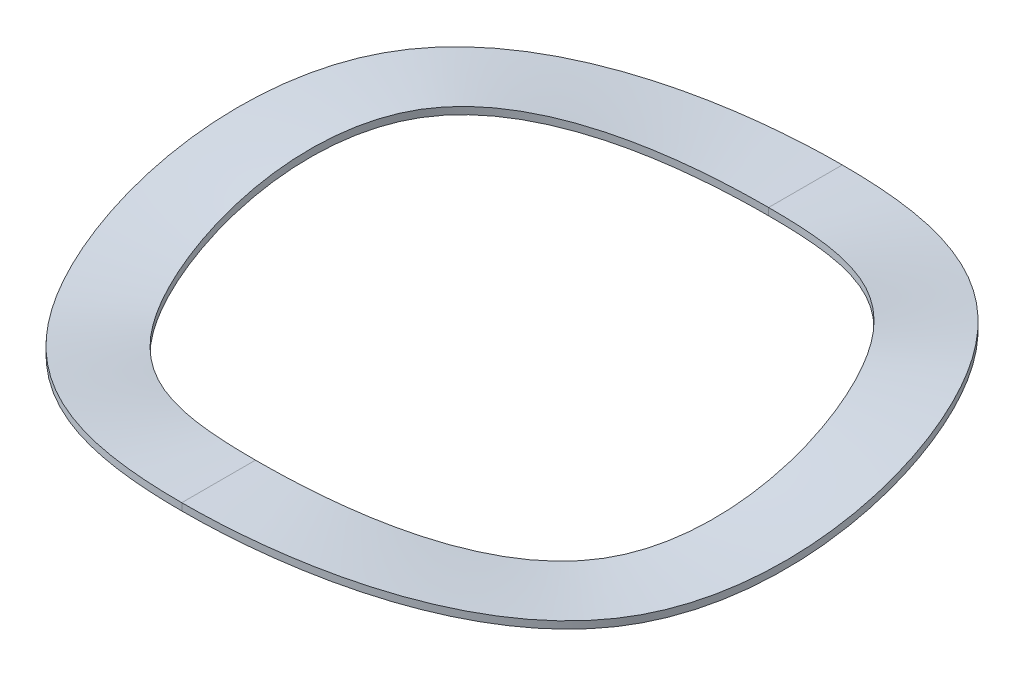
ISO-10303-21;
HEADER;
FILE_DESCRIPTION(('STEP AP214'),'2;1');
FILE_NAME('part.step','',(''),(''),'','','');
FILE_SCHEMA(('AUTOMOTIVE_DESIGN { 1 0 10303 214 1 1 1 1 }'));
ENDSEC;
DATA;
#1=APPLICATION_CONTEXT('core data for automotive mechanical design processes');
#2=APPLICATION_PROTOCOL_DEFINITION('international standard','automotive_design',2000,#1);
#3=PRODUCT_CONTEXT('',#1,'mechanical');
#4=PRODUCT('Part','Part','',(#3));
#5=PRODUCT_RELATED_PRODUCT_CATEGORY('part','',(#4));
#6=PRODUCT_DEFINITION_FORMATION('','',#4);
#7=PRODUCT_DEFINITION_CONTEXT('part definition',#1,'design');
#8=PRODUCT_DEFINITION('design','',#6,#7);
#9=PRODUCT_DEFINITION_SHAPE('','',#8);
#10=(LENGTH_UNIT() NAMED_UNIT(*) SI_UNIT(.MILLI.,.METRE.));
#11=(NAMED_UNIT(*) PLANE_ANGLE_UNIT() SI_UNIT($,.RADIAN.));
#12=(NAMED_UNIT(*) SI_UNIT($,.STERADIAN.) SOLID_ANGLE_UNIT());
#13=UNCERTAINTY_MEASURE_WITH_UNIT(LENGTH_MEASURE(1.E-05),#10,'distance_accuracy_value','');
#14=(GEOMETRIC_REPRESENTATION_CONTEXT(3) GLOBAL_UNCERTAINTY_ASSIGNED_CONTEXT((#13)) GLOBAL_UNIT_ASSIGNED_CONTEXT((#10,
#11,#12)) REPRESENTATION_CONTEXT('',''));
#15=CARTESIAN_POINT('',(0.,0.,0.));
#16=DIRECTION('',(0.,0.,1.));
#17=DIRECTION('',(1.,0.,0.));
#18=AXIS2_PLACEMENT_3D('',#15,#16,#17);
#19=CARTESIAN_POINT('',(0.,0.3048,-10.8712));
#20=CARTESIAN_POINT('',(3.76589414784855,0.3048,-10.8712));
#21=CARTESIAN_POINT('',(11.2976824435457,3.5052,-6.52272));
#22=CARTESIAN_POINT('',(11.2976824435456,-1.2954,6.52272));
#23=CARTESIAN_POINT('',(3.76589414784856,1.905,10.8712));
#24=CARTESIAN_POINT('',(0.,1.905,10.8712));
#25=CARTESIAN_POINT('',(0.,0.2032,-10.8712));
#26=CARTESIAN_POINT('',(3.76589414784855,0.2032,-10.8712));
#27=CARTESIAN_POINT('',(11.2976824435457,3.4036,-6.52272));
#28=CARTESIAN_POINT('',(11.2976824435456,-1.397,6.52272));
#29=CARTESIAN_POINT('',(3.76589414784856,1.8034,10.8712));
#30=CARTESIAN_POINT('',(0.,1.8034,10.8712));
#31=CARTESIAN_POINT('',(0.,0.1016,-10.8712));
#32=CARTESIAN_POINT('',(3.76589414784855,0.101599999999999,-10.8712));
#33=CARTESIAN_POINT('',(11.2976824435457,3.302,-6.52272));
#34=CARTESIAN_POINT('',(11.2976824435456,-1.4986,6.52272));
#35=CARTESIAN_POINT('',(3.76589414784856,1.7018,10.8712));
#36=CARTESIAN_POINT('',(0.,1.7018,10.8712));
#37=CARTESIAN_POINT('',(0.,0.,-10.8712));
#38=CARTESIAN_POINT('',(3.76589414784855,0.,-10.8712));
#39=CARTESIAN_POINT('',(11.2976824435457,3.2004,-6.52272));
#40=CARTESIAN_POINT('',(11.2976824435456,-1.6002,6.52272));
#41=CARTESIAN_POINT('',(3.76589414784856,1.6002,10.8712));
#42=CARTESIAN_POINT('',(0.,1.6002,10.8712));
#43=(BOUNDED_SURFACE() B_SPLINE_SURFACE(3,3,((#19,#20,#21,#22,#23,#24),(#25,#26,#27,#28,#29,
#30),(#31,#32,#33,#34,#35,#36),(#37,#38,#39,#40,#41,#42)),.UNSPECIFIED.,.F.,.F.,
.F.) B_SPLINE_SURFACE_WITH_KNOTS((4,4),(4,1,1,4),(0.,1.),(0.,0.166666666666667,
0.333333333333334,0.5),
.UNSPECIFIED.) GEOMETRIC_REPRESENTATION_ITEM() RATIONAL_B_SPLINE_SURFACE(((1.,1.,1.,1.,1.,1.),
(1.,1.,1.,1.,1.,1.),(1.,1.,1.,1.,1.,1.),(1.,1.,1.,1.,1.,1.))) REPRESENTATION_ITEM('') SURFACE());
#44=CARTESIAN_POINT('',(0.,1.905,10.8712));
#45=CARTESIAN_POINT('',(0.,1.8034,10.8712));
#46=CARTESIAN_POINT('',(0.,1.7018,10.8712));
#47=CARTESIAN_POINT('',(0.,1.6002,10.8712));
#48=(BOUNDED_CURVE() B_SPLINE_CURVE(3,(#44,#45,#46,#47),.UNSPECIFIED.,.F.,
.F.) B_SPLINE_CURVE_WITH_KNOTS((4,4),(0.,1.),
.UNSPECIFIED.) CURVE() GEOMETRIC_REPRESENTATION_ITEM() RATIONAL_B_SPLINE_CURVE((1.,1.,1.,1.)) REPRESENTATION_ITEM(''));
#49=CARTESIAN_POINT('',(0.,1.905,10.8712));
#50=VERTEX_POINT('',#49);
#51=CARTESIAN_POINT('',(0.,1.6002,10.8712));
#52=VERTEX_POINT('',#51);
#53=EDGE_CURVE('E81',#50,#52,#48,.T.);
#54=CARTESIAN_POINT('',(0.,0.3048,-10.8712));
#55=CARTESIAN_POINT('',(3.76589414784855,0.3048,-10.8712));
#56=CARTESIAN_POINT('',(11.2976824435457,3.5052,-6.52272));
#57=CARTESIAN_POINT('',(11.2976824435456,-1.2954,6.52272));
#58=CARTESIAN_POINT('',(3.76589414784856,1.905,10.8712));
#59=CARTESIAN_POINT('',(0.,1.905,10.8712));
#60=(BOUNDED_CURVE() B_SPLINE_CURVE(3,(#54,#55,#56,#57,#58,#59),.UNSPECIFIED.,.F.,
.F.) B_SPLINE_CURVE_WITH_KNOTS((4,1,1,4),(0.,0.166666666666667,0.333333333333334,0.5),
.UNSPECIFIED.) CURVE() GEOMETRIC_REPRESENTATION_ITEM() RATIONAL_B_SPLINE_CURVE((1.,1.,1.,1.,1.,1.)) REPRESENTATION_ITEM(''));
#61=CARTESIAN_POINT('',(0.,0.3048,-10.8712));
#62=VERTEX_POINT('',#61);
#63=EDGE_CURVE('E11',#62,#50,#60,.T.);
#64=CARTESIAN_POINT('',(0.,0.3048,-10.8712));
#65=CARTESIAN_POINT('',(0.,0.2032,-10.8712));
#66=CARTESIAN_POINT('',(0.,0.1016,-10.8712));
#67=CARTESIAN_POINT('',(0.,0.,-10.8712));
#68=(BOUNDED_CURVE() B_SPLINE_CURVE(3,(#64,#65,#66,#67),.UNSPECIFIED.,.F.,
.F.) B_SPLINE_CURVE_WITH_KNOTS((4,4),(0.,1.),
.UNSPECIFIED.) CURVE() GEOMETRIC_REPRESENTATION_ITEM() RATIONAL_B_SPLINE_CURVE((1.,1.,1.,1.)) REPRESENTATION_ITEM(''));
#69=CARTESIAN_POINT('',(0.,0.,-10.8712));
#70=VERTEX_POINT('',#69);
#71=EDGE_CURVE('E84',#62,#70,#68,.T.);
#72=CARTESIAN_POINT('',(0.,0.,-10.8712));
#73=CARTESIAN_POINT('',(3.76589414784855,0.,-10.8712));
#74=CARTESIAN_POINT('',(11.2976824435457,3.2004,-6.52272));
#75=CARTESIAN_POINT('',(11.2976824435456,-1.6002,6.52272));
#76=CARTESIAN_POINT('',(3.76589414784856,1.6002,10.8712));
#77=CARTESIAN_POINT('',(0.,1.6002,10.8712));
#78=(BOUNDED_CURVE() B_SPLINE_CURVE(3,(#72,#73,#74,#75,#76,#77),.UNSPECIFIED.,.F.,
.F.) B_SPLINE_CURVE_WITH_KNOTS((4,1,1,4),(0.,0.166666666666667,0.333333333333334,0.5),
.UNSPECIFIED.) CURVE() GEOMETRIC_REPRESENTATION_ITEM() RATIONAL_B_SPLINE_CURVE((1.,1.,1.,1.,1.,1.)) REPRESENTATION_ITEM(''));
#79=EDGE_CURVE('E31',#70,#52,#78,.T.);
#80=ORIENTED_EDGE('',*,*,#53,.F.);
#81=ORIENTED_EDGE('',*,*,#63,.F.);
#82=ORIENTED_EDGE('',*,*,#71,.T.);
#83=ORIENTED_EDGE('',*,*,#79,.T.);
#84=EDGE_LOOP('',(#80,#81,#82,#83));
#85=FACE_BOUND('',#84,.T.);
#86=ADVANCED_FACE('F16',(#85),#43,.T.);
#87=CARTESIAN_POINT('',(0.,0.3048,-13.9954));
#88=CARTESIAN_POINT('',(4.84814877444989,0.3048,-13.9954));
#89=CARTESIAN_POINT('',(14.5444463233497,3.5052,-8.39724));
#90=CARTESIAN_POINT('',(14.5444463233496,-1.2954,8.39724));
#91=CARTESIAN_POINT('',(4.84814877444989,1.905,13.9954));
#92=CARTESIAN_POINT('',(0.,1.905,13.9954));
#93=CARTESIAN_POINT('',(0.,0.3048,-12.954));
#94=CARTESIAN_POINT('',(4.48739723224945,0.3048,-12.954));
#95=CARTESIAN_POINT('',(13.4621916967484,3.5052,-7.7724));
#96=CARTESIAN_POINT('',(13.4621916967483,-1.2954,7.7724));
#97=CARTESIAN_POINT('',(4.48739723224945,1.905,12.954));
#98=CARTESIAN_POINT('',(0.,1.905,12.954));
#99=CARTESIAN_POINT('',(0.,0.3048,-11.9126));
#100=CARTESIAN_POINT('',(4.126645690049,0.3048,-11.9126));
#101=CARTESIAN_POINT('',(12.379937070147,3.5052,-7.14756));
#102=CARTESIAN_POINT('',(12.379937070147,-1.2954,7.14756));
#103=CARTESIAN_POINT('',(4.126645690049,1.905,11.9126));
#104=CARTESIAN_POINT('',(0.,1.905,11.9126));
#105=CARTESIAN_POINT('',(0.,0.3048,-10.8712));
#106=CARTESIAN_POINT('',(3.76589414784855,0.3048,-10.8712));
#107=CARTESIAN_POINT('',(11.2976824435457,3.5052,-6.52272));
#108=CARTESIAN_POINT('',(11.2976824435456,-1.2954,6.52272));
#109=CARTESIAN_POINT('',(3.76589414784856,1.905,10.8712));
#110=CARTESIAN_POINT('',(0.,1.905,10.8712));
#111=(BOUNDED_SURFACE() B_SPLINE_SURFACE(3,3,((#87,#88,#89,#90,#91,#92),(#93,#94,#95,#96,#97,
#98),(#99,#100,#101,#102,#103,#104),(#105,#106,#107,#108,#109,#110)),.UNSPECIFIED.,.F.,.F.,
.F.) B_SPLINE_SURFACE_WITH_KNOTS((4,4),(4,1,1,4),(0.,1.),(0.,0.166666666666667,
0.333333333333334,0.5),
.UNSPECIFIED.) GEOMETRIC_REPRESENTATION_ITEM() RATIONAL_B_SPLINE_SURFACE(((1.,1.,1.,1.,1.,1.),
(1.,1.,1.,1.,1.,1.),(1.,1.,1.,1.,1.,1.),(1.,1.,1.,1.,1.,1.))) REPRESENTATION_ITEM('') SURFACE());
#112=CARTESIAN_POINT('',(0.,1.905,13.9954));
#113=CARTESIAN_POINT('',(0.,1.905,12.954));
#114=CARTESIAN_POINT('',(0.,1.905,11.9126));
#115=CARTESIAN_POINT('',(0.,1.905,10.8712));
#116=(BOUNDED_CURVE() B_SPLINE_CURVE(3,(#112,#113,#114,#115),.UNSPECIFIED.,.F.,
.F.) B_SPLINE_CURVE_WITH_KNOTS((4,4),(0.,1.),
.UNSPECIFIED.) CURVE() GEOMETRIC_REPRESENTATION_ITEM() RATIONAL_B_SPLINE_CURVE((1.,1.,1.,1.)) REPRESENTATION_ITEM(''));
#117=CARTESIAN_POINT('',(0.,1.905,13.9954));
#118=VERTEX_POINT('',#117);
#119=EDGE_CURVE('E193',#118,#50,#116,.T.);
#120=CARTESIAN_POINT('',(0.,0.3048,-13.9954));
#121=CARTESIAN_POINT('',(4.84814877444989,0.3048,-13.9954));
#122=CARTESIAN_POINT('',(14.5444463233497,3.5052,-8.39724));
#123=CARTESIAN_POINT('',(14.5444463233496,-1.2954,8.39724));
#124=CARTESIAN_POINT('',(4.84814877444989,1.905,13.9954));
#125=CARTESIAN_POINT('',(0.,1.905,13.9954));
#126=(BOUNDED_CURVE() B_SPLINE_CURVE(3,(#120,#121,#122,#123,#124,#125),.UNSPECIFIED.,.F.,
.F.) B_SPLINE_CURVE_WITH_KNOTS((4,1,1,4),(0.,0.166666666666667,0.333333333333334,0.5),
.UNSPECIFIED.) CURVE() GEOMETRIC_REPRESENTATION_ITEM() RATIONAL_B_SPLINE_CURVE((1.,1.,1.,1.,1.,1.)) REPRESENTATION_ITEM(''));
#127=CARTESIAN_POINT('',(0.,0.3048,-13.9954));
#128=VERTEX_POINT('',#127);
#129=EDGE_CURVE('E87',#128,#118,#126,.T.);
#130=CARTESIAN_POINT('',(0.,0.3048,-13.9954));
#131=CARTESIAN_POINT('',(0.,0.3048,-12.954));
#132=CARTESIAN_POINT('',(0.,0.3048,-11.9126));
#133=CARTESIAN_POINT('',(0.,0.3048,-10.8712));
#134=(BOUNDED_CURVE() B_SPLINE_CURVE(3,(#130,#131,#132,#133),.UNSPECIFIED.,.F.,
.F.) B_SPLINE_CURVE_WITH_KNOTS((4,4),(0.,1.),
.UNSPECIFIED.) CURVE() GEOMETRIC_REPRESENTATION_ITEM() RATIONAL_B_SPLINE_CURVE((1.,1.,1.,1.)) REPRESENTATION_ITEM(''));
#135=EDGE_CURVE('E22',#128,#62,#134,.T.);
#136=ORIENTED_EDGE('',*,*,#119,.F.);
#137=ORIENTED_EDGE('',*,*,#129,.F.);
#138=ORIENTED_EDGE('',*,*,#135,.T.);
#139=ORIENTED_EDGE('',*,*,#63,.T.);
#140=EDGE_LOOP('',(#136,#137,#138,#139));
#141=FACE_BOUND('',#140,.T.);
#142=ADVANCED_FACE('F228',(#141),#111,.T.);
#143=CARTESIAN_POINT('',(0.,0.,-10.8712));
#144=CARTESIAN_POINT('',(3.76589414784855,0.,-10.8712));
#145=CARTESIAN_POINT('',(11.2976824435457,3.2004,-6.52272));
#146=CARTESIAN_POINT('',(11.2976824435456,-1.6002,6.52272));
#147=CARTESIAN_POINT('',(3.76589414784856,1.6002,10.8712));
#148=CARTESIAN_POINT('',(0.,1.6002,10.8712));
#149=CARTESIAN_POINT('',(0.,0.,-11.9126));
#150=CARTESIAN_POINT('',(4.126645690049,0.,-11.9126));
#151=CARTESIAN_POINT('',(12.379937070147,3.2004,-7.14756));
#152=CARTESIAN_POINT('',(12.379937070147,-1.6002,7.14756));
#153=CARTESIAN_POINT('',(4.126645690049,1.6002,11.9126));
#154=CARTESIAN_POINT('',(0.,1.6002,11.9126));
#155=CARTESIAN_POINT('',(0.,0.,-12.954));
#156=CARTESIAN_POINT('',(4.48739723224945,0.,-12.954));
#157=CARTESIAN_POINT('',(13.4621916967484,3.2004,-7.7724));
#158=CARTESIAN_POINT('',(13.4621916967483,-1.6002,7.7724));
#159=CARTESIAN_POINT('',(4.48739723224945,1.6002,12.954));
#160=CARTESIAN_POINT('',(0.,1.6002,12.954));
#161=CARTESIAN_POINT('',(0.,0.,-13.9954));
#162=CARTESIAN_POINT('',(4.84814877444989,0.,-13.9954));
#163=CARTESIAN_POINT('',(14.5444463233497,3.2004,-8.39724));
#164=CARTESIAN_POINT('',(14.5444463233496,-1.6002,8.39724));
#165=CARTESIAN_POINT('',(4.84814877444989,1.6002,13.9954));
#166=CARTESIAN_POINT('',(0.,1.6002,13.9954));
#167=(BOUNDED_SURFACE() B_SPLINE_SURFACE(3,3,((#143,#144,#145,#146,#147,#148),(#149,#150,#151,
#152,#153,#154),(#155,#156,#157,#158,#159,#160),(#161,#162,#163,#164,#165,#166)),.UNSPECIFIED.,
.F.,.F.,.F.) B_SPLINE_SURFACE_WITH_KNOTS((4,4),(4,1,1,4),(0.,1.),(0.,0.166666666666667,
0.333333333333334,0.5),
.UNSPECIFIED.) GEOMETRIC_REPRESENTATION_ITEM() RATIONAL_B_SPLINE_SURFACE(((1.,1.,1.,1.,1.,1.),
(1.,1.,1.,1.,1.,1.),(1.,1.,1.,1.,1.,1.),(1.,1.,1.,1.,1.,1.))) REPRESENTATION_ITEM('') SURFACE());
#168=CARTESIAN_POINT('',(0.,1.6002,10.8712));
#169=CARTESIAN_POINT('',(0.,1.6002,11.9126));
#170=CARTESIAN_POINT('',(0.,1.6002,12.954));
#171=CARTESIAN_POINT('',(0.,1.6002,13.9954));
#172=(BOUNDED_CURVE() B_SPLINE_CURVE(3,(#168,#169,#170,#171),.UNSPECIFIED.,.F.,
.F.) B_SPLINE_CURVE_WITH_KNOTS((4,4),(0.,1.),
.UNSPECIFIED.) CURVE() GEOMETRIC_REPRESENTATION_ITEM() RATIONAL_B_SPLINE_CURVE((1.,1.,1.,1.)) REPRESENTATION_ITEM(''));
#173=CARTESIAN_POINT('',(0.,1.6002,13.9954));
#174=VERTEX_POINT('',#173);
#175=EDGE_CURVE('E89',#52,#174,#172,.T.);
#176=CARTESIAN_POINT('',(0.,0.,-10.8712));
#177=CARTESIAN_POINT('',(0.,0.,-11.9126));
#178=CARTESIAN_POINT('',(0.,0.,-12.954));
#179=CARTESIAN_POINT('',(0.,0.,-13.9954));
#180=(BOUNDED_CURVE() B_SPLINE_CURVE(3,(#176,#177,#178,#179),.UNSPECIFIED.,.F.,
.F.) B_SPLINE_CURVE_WITH_KNOTS((4,4),(0.,1.),
.UNSPECIFIED.) CURVE() GEOMETRIC_REPRESENTATION_ITEM() RATIONAL_B_SPLINE_CURVE((1.,1.,1.,1.)) REPRESENTATION_ITEM(''));
#181=CARTESIAN_POINT('',(0.,0.,-13.9954));
#182=VERTEX_POINT('',#181);
#183=EDGE_CURVE('E99',#70,#182,#180,.T.);
#184=CARTESIAN_POINT('',(0.,1.6002,13.9954));
#185=CARTESIAN_POINT('',(4.84814877444989,1.6002,13.9954));
#186=CARTESIAN_POINT('',(14.5444463233496,-1.6002,8.39724));
#187=CARTESIAN_POINT('',(14.5444463233497,3.2004,-8.39724));
#188=CARTESIAN_POINT('',(4.84814877444989,0.,-13.9954));
#189=CARTESIAN_POINT('',(0.,0.,-13.9954));
#190=(BOUNDED_CURVE() B_SPLINE_CURVE(3,(#184,#185,#186,#187,#188,#189),.UNSPECIFIED.,.F.,
.F.) B_SPLINE_CURVE_WITH_KNOTS((4,1,1,4),(0.5,0.666666666666666,0.833333333333333,1.),
.UNSPECIFIED.) CURVE() GEOMETRIC_REPRESENTATION_ITEM() RATIONAL_B_SPLINE_CURVE((1.,1.,1.,1.,1.,1.)) REPRESENTATION_ITEM(''));
#191=EDGE_CURVE('E46',#174,#182,#190,.T.);
#192=ORIENTED_EDGE('',*,*,#175,.F.);
#193=ORIENTED_EDGE('',*,*,#79,.F.);
#194=ORIENTED_EDGE('',*,*,#183,.T.);
#195=ORIENTED_EDGE('',*,*,#191,.F.);
#196=EDGE_LOOP('',(#192,#193,#194,#195));
#197=FACE_BOUND('',#196,.T.);
#198=ADVANCED_FACE('F91',(#197),#167,.T.);
#199=CARTESIAN_POINT('',(0.,0.,-13.9954));
#200=CARTESIAN_POINT('',(4.84814877444989,0.,-13.9954));
#201=CARTESIAN_POINT('',(14.5444463233497,3.2004,-8.39724));
#202=CARTESIAN_POINT('',(14.5444463233496,-1.6002,8.39724));
#203=CARTESIAN_POINT('',(4.84814877444989,1.6002,13.9954));
#204=CARTESIAN_POINT('',(0.,1.6002,13.9954));
#205=CARTESIAN_POINT('',(0.,0.1016,-13.9954));
#206=CARTESIAN_POINT('',(4.84814877444989,0.1016,-13.9954));
#207=CARTESIAN_POINT('',(14.5444463233497,3.302,-8.39724));
#208=CARTESIAN_POINT('',(14.5444463233496,-1.4986,8.39724));
#209=CARTESIAN_POINT('',(4.84814877444989,1.7018,13.9954));
#210=CARTESIAN_POINT('',(0.,1.7018,13.9954));
#211=CARTESIAN_POINT('',(0.,0.2032,-13.9954));
#212=CARTESIAN_POINT('',(4.84814877444989,0.2032,-13.9954));
#213=CARTESIAN_POINT('',(14.5444463233497,3.4036,-8.39724));
#214=CARTESIAN_POINT('',(14.5444463233496,-1.397,8.39724));
#215=CARTESIAN_POINT('',(4.84814877444989,1.8034,13.9954));
#216=CARTESIAN_POINT('',(0.,1.8034,13.9954));
#217=CARTESIAN_POINT('',(0.,0.3048,-13.9954));
#218=CARTESIAN_POINT('',(4.84814877444989,0.3048,-13.9954));
#219=CARTESIAN_POINT('',(14.5444463233497,3.5052,-8.39724));
#220=CARTESIAN_POINT('',(14.5444463233496,-1.2954,8.39724));
#221=CARTESIAN_POINT('',(4.84814877444989,1.905,13.9954));
#222=CARTESIAN_POINT('',(0.,1.905,13.9954));
#223=(BOUNDED_SURFACE() B_SPLINE_SURFACE(3,3,((#199,#200,#201,#202,#203,#204),(#205,#206,#207,
#208,#209,#210),(#211,#212,#213,#214,#215,#216),(#217,#218,#219,#220,#221,#222)),.UNSPECIFIED.,
.F.,.F.,.F.) B_SPLINE_SURFACE_WITH_KNOTS((4,4),(4,1,1,4),(0.,1.),(0.,0.166666666666667,
0.333333333333334,0.5),
.UNSPECIFIED.) GEOMETRIC_REPRESENTATION_ITEM() RATIONAL_B_SPLINE_SURFACE(((1.,1.,1.,1.,1.,1.),
(1.,1.,1.,1.,1.,1.),(1.,1.,1.,1.,1.,1.),(1.,1.,1.,1.,1.,1.))) REPRESENTATION_ITEM('') SURFACE());
#224=CARTESIAN_POINT('',(0.,1.6002,13.9954));
#225=CARTESIAN_POINT('',(0.,1.7018,13.9954));
#226=CARTESIAN_POINT('',(0.,1.8034,13.9954));
#227=CARTESIAN_POINT('',(0.,1.905,13.9954));
#228=(BOUNDED_CURVE() B_SPLINE_CURVE(3,(#224,#225,#226,#227),.UNSPECIFIED.,.F.,
.F.) B_SPLINE_CURVE_WITH_KNOTS((4,4),(0.,1.),
.UNSPECIFIED.) CURVE() GEOMETRIC_REPRESENTATION_ITEM() RATIONAL_B_SPLINE_CURVE((1.,1.,1.,1.)) REPRESENTATION_ITEM(''));
#229=EDGE_CURVE('E136',#174,#118,#228,.T.);
#230=CARTESIAN_POINT('',(0.,0.,-13.9954));
#231=CARTESIAN_POINT('',(0.,0.1016,-13.9954));
#232=CARTESIAN_POINT('',(0.,0.2032,-13.9954));
#233=CARTESIAN_POINT('',(0.,0.3048,-13.9954));
#234=(BOUNDED_CURVE() B_SPLINE_CURVE(3,(#230,#231,#232,#233),.UNSPECIFIED.,.F.,
.F.) B_SPLINE_CURVE_WITH_KNOTS((4,4),(0.,1.),
.UNSPECIFIED.) CURVE() GEOMETRIC_REPRESENTATION_ITEM() RATIONAL_B_SPLINE_CURVE((1.,1.,1.,1.)) REPRESENTATION_ITEM(''));
#235=EDGE_CURVE('E143',#182,#128,#234,.T.);
#236=ORIENTED_EDGE('',*,*,#229,.F.);
#237=ORIENTED_EDGE('',*,*,#191,.T.);
#238=ORIENTED_EDGE('',*,*,#235,.T.);
#239=ORIENTED_EDGE('',*,*,#129,.T.);
#240=EDGE_LOOP('',(#236,#237,#238,#239));
#241=FACE_BOUND('',#240,.T.);
#242=ADVANCED_FACE('F265',(#241),#223,.T.);
#243=CARTESIAN_POINT('',(0.,1.6002,13.9954));
#244=CARTESIAN_POINT('',(-4.84814877444989,1.6002,13.9954));
#245=CARTESIAN_POINT('',(-14.5444463233498,-1.6002,8.39724));
#246=CARTESIAN_POINT('',(-14.5444463233497,1.6002,-2.79908000000006));
#247=CARTESIAN_POINT('',(-9.69629754889975,1.6002,-11.19632));
#248=CARTESIAN_POINT('',(-4.84814877444989,0.,-13.9954));
#249=CARTESIAN_POINT('',(0.,0.,-13.9954));
#250=CARTESIAN_POINT('',(0.,1.7018,13.9954));
#251=CARTESIAN_POINT('',(-4.84814877444989,1.7018,13.9954));
#252=CARTESIAN_POINT('',(-14.5444463233498,-1.4986,8.39724));
#253=CARTESIAN_POINT('',(-14.5444463233497,1.7018,-2.79908000000006));
#254=CARTESIAN_POINT('',(-9.69629754889975,1.7018,-11.19632));
#255=CARTESIAN_POINT('',(-4.84814877444989,0.1016,-13.9954));
#256=CARTESIAN_POINT('',(0.,0.1016,-13.9954));
#257=CARTESIAN_POINT('',(0.,1.8034,13.9954));
#258=CARTESIAN_POINT('',(-4.84814877444989,1.8034,13.9954));
#259=CARTESIAN_POINT('',(-14.5444463233498,-1.397,8.39724));
#260=CARTESIAN_POINT('',(-14.5444463233497,1.8034,-2.79908000000006));
#261=CARTESIAN_POINT('',(-9.69629754889975,1.8034,-11.19632));
#262=CARTESIAN_POINT('',(-4.84814877444989,0.2032,-13.9954));
#263=CARTESIAN_POINT('',(0.,0.2032,-13.9954));
#264=CARTESIAN_POINT('',(0.,1.905,13.9954));
#265=CARTESIAN_POINT('',(-4.84814877444989,1.905,13.9954));
#266=CARTESIAN_POINT('',(-14.5444463233498,-1.2954,8.39724));
#267=CARTESIAN_POINT('',(-14.5444463233497,1.905,-2.79908000000006));
#268=CARTESIAN_POINT('',(-9.69629754889975,1.905,-11.19632));
#269=CARTESIAN_POINT('',(-4.84814877444989,0.3048,-13.9954));
#270=CARTESIAN_POINT('',(0.,0.3048,-13.9954));
#271=(BOUNDED_SURFACE() B_SPLINE_SURFACE(3,3,((#243,#244,#245,#246,#247,#248,#249),(#250,#251,
#252,#253,#254,#255,#256),(#257,#258,#259,#260,#261,#262,#263),(#264,#265,#266,#267,#268,#269,
#270)),.UNSPECIFIED.,.F.,.F.,.F.) B_SPLINE_SURFACE_WITH_KNOTS((4,4),(4,1,2,4),(0.,1.),(0.5,
0.666666666666666,0.833333333333333,1.),
.UNSPECIFIED.) GEOMETRIC_REPRESENTATION_ITEM() RATIONAL_B_SPLINE_SURFACE(((1.,1.,1.,1.,1.,1.,
1.),(1.,1.,1.,1.,1.,1.,1.),(1.,1.,1.,1.,1.,1.,1.),(1.,1.,1.,1.,1.,1.,1.))) REPRESENTATION_ITEM('') SURFACE());
#272=CARTESIAN_POINT('',(0.,0.,-13.9954));
#273=CARTESIAN_POINT('',(-4.84814877444989,0.,-13.9954));
#274=CARTESIAN_POINT('',(-9.69629754889975,1.6002,-11.19632));
#275=CARTESIAN_POINT('',(-14.5444463233497,1.6002,-2.79908000000006));
#276=CARTESIAN_POINT('',(-14.5444463233498,-1.6002,8.39724));
#277=CARTESIAN_POINT('',(-4.84814877444989,1.6002,13.9954));
#278=CARTESIAN_POINT('',(0.,1.6002,13.9954));
#279=(BOUNDED_CURVE() B_SPLINE_CURVE(3,(#272,#273,#274,#275,#276,#277,#278),.UNSPECIFIED.,.F.,
.F.) B_SPLINE_CURVE_WITH_KNOTS((4,2,1,4),(0.,0.166666666666667,0.333333333333334,0.5),
.UNSPECIFIED.) CURVE() GEOMETRIC_REPRESENTATION_ITEM() RATIONAL_B_SPLINE_CURVE((1.,1.,1.,1.,1.,
1.,1.)) REPRESENTATION_ITEM(''));
#280=EDGE_CURVE('E95',#182,#174,#279,.T.);
#281=CARTESIAN_POINT('',(0.,1.905,13.9954));
#282=CARTESIAN_POINT('',(-4.84814877444989,1.905,13.9954));
#283=CARTESIAN_POINT('',(-14.5444463233498,-1.2954,8.39724));
#284=CARTESIAN_POINT('',(-14.5444463233497,1.905,-2.79908000000006));
#285=CARTESIAN_POINT('',(-9.69629754889975,1.905,-11.19632));
#286=CARTESIAN_POINT('',(-4.84814877444989,0.3048,-13.9954));
#287=CARTESIAN_POINT('',(0.,0.3048,-13.9954));
#288=(BOUNDED_CURVE() B_SPLINE_CURVE(3,(#281,#282,#283,#284,#285,#286,#287),.UNSPECIFIED.,.F.,
.F.) B_SPLINE_CURVE_WITH_KNOTS((4,1,2,4),(0.5,0.666666666666666,0.833333333333333,1.),
.UNSPECIFIED.) CURVE() GEOMETRIC_REPRESENTATION_ITEM() RATIONAL_B_SPLINE_CURVE((1.,1.,1.,1.,1.,
1.,1.)) REPRESENTATION_ITEM(''));
#289=EDGE_CURVE('E158',#118,#128,#288,.T.);
#290=ORIENTED_EDGE('',*,*,#280,.T.);
#291=ORIENTED_EDGE('',*,*,#229,.T.);
#292=ORIENTED_EDGE('',*,*,#289,.T.);
#293=ORIENTED_EDGE('',*,*,#235,.F.);
#294=EDGE_LOOP('',(#290,#291,#292,#293));
#295=FACE_BOUND('',#294,.T.);
#296=ADVANCED_FACE('F236',(#295),#271,.T.);
#297=CARTESIAN_POINT('',(0.,1.6002,10.8712));
#298=CARTESIAN_POINT('',(-3.76589414784855,1.6002,10.8712));
#299=CARTESIAN_POINT('',(-11.2976824435457,-1.6002,6.52272));
#300=CARTESIAN_POINT('',(-11.2976824435456,1.6002,-2.17424000000005));
#301=CARTESIAN_POINT('',(-7.53178829569708,1.6002,-8.69696));
#302=CARTESIAN_POINT('',(-3.76589414784855,0.,-10.8712));
#303=CARTESIAN_POINT('',(0.,0.,-10.8712));
#304=CARTESIAN_POINT('',(0.,1.6002,11.9126));
#305=CARTESIAN_POINT('',(-4.12664569004899,1.6002,11.9126));
#306=CARTESIAN_POINT('',(-12.3799370701471,-1.6002,7.14756));
#307=CARTESIAN_POINT('',(-12.379937070147,1.6002,-2.38252000000006));
#308=CARTESIAN_POINT('',(-8.25329138009797,1.6002,-9.53008));
#309=CARTESIAN_POINT('',(-4.12664569004899,0.,-11.9126));
#310=CARTESIAN_POINT('',(0.,0.,-11.9126));
#311=CARTESIAN_POINT('',(0.,1.6002,12.954));
#312=CARTESIAN_POINT('',(-4.48739723224944,1.6002,12.954));
#313=CARTESIAN_POINT('',(-13.4621916967484,-1.6002,7.7724));
#314=CARTESIAN_POINT('',(-13.4621916967483,1.6002,-2.59080000000006));
#315=CARTESIAN_POINT('',(-8.97479446449886,1.6002,-10.3632));
#316=CARTESIAN_POINT('',(-4.48739723224944,0.,-12.954));
#317=CARTESIAN_POINT('',(0.,0.,-12.954));
#318=CARTESIAN_POINT('',(0.,1.6002,13.9954));
#319=CARTESIAN_POINT('',(-4.84814877444989,1.6002,13.9954));
#320=CARTESIAN_POINT('',(-14.5444463233498,-1.6002,8.39724));
#321=CARTESIAN_POINT('',(-14.5444463233497,1.6002,-2.79908000000006));
#322=CARTESIAN_POINT('',(-9.69629754889975,1.6002,-11.19632));
#323=CARTESIAN_POINT('',(-4.84814877444989,0.,-13.9954));
#324=CARTESIAN_POINT('',(0.,0.,-13.9954));
#325=(BOUNDED_SURFACE() B_SPLINE_SURFACE(3,3,((#297,#298,#299,#300,#301,#302,#303),(#304,#305,
#306,#307,#308,#309,#310),(#311,#312,#313,#314,#315,#316,#317),(#318,#319,#320,#321,#322,#323,
#324)),.UNSPECIFIED.,.F.,.F.,.F.) B_SPLINE_SURFACE_WITH_KNOTS((4,4),(4,1,2,4),(0.,1.),(0.5,
0.666666666666666,0.833333333333333,1.),
.UNSPECIFIED.) GEOMETRIC_REPRESENTATION_ITEM() RATIONAL_B_SPLINE_SURFACE(((1.,1.,1.,1.,1.,1.,
1.),(1.,1.,1.,1.,1.,1.,1.),(1.,1.,1.,1.,1.,1.,1.),(1.,1.,1.,1.,1.,1.,1.))) REPRESENTATION_ITEM('') SURFACE());
#326=CARTESIAN_POINT('',(0.,1.6002,10.8712));
#327=CARTESIAN_POINT('',(-3.76589414784855,1.6002,10.8712));
#328=CARTESIAN_POINT('',(-11.2976824435457,-1.6002,6.52272));
#329=CARTESIAN_POINT('',(-11.2976824435456,1.6002,-2.17424000000005));
#330=CARTESIAN_POINT('',(-7.53178829569708,1.6002,-8.69696));
#331=CARTESIAN_POINT('',(-3.76589414784855,0.,-10.8712));
#332=CARTESIAN_POINT('',(0.,0.,-10.8712));
#333=(BOUNDED_CURVE() B_SPLINE_CURVE(3,(#326,#327,#328,#329,#330,#331,#332),.UNSPECIFIED.,.F.,
.F.) B_SPLINE_CURVE_WITH_KNOTS((4,1,2,4),(0.5,0.666666666666666,0.833333333333333,1.),
.UNSPECIFIED.) CURVE() GEOMETRIC_REPRESENTATION_ITEM() RATIONAL_B_SPLINE_CURVE((1.,1.,1.,1.,1.,
1.,1.)) REPRESENTATION_ITEM(''));
#334=EDGE_CURVE('E97',#52,#70,#333,.T.);
#335=ORIENTED_EDGE('',*,*,#334,.F.);
#336=ORIENTED_EDGE('',*,*,#175,.T.);
#337=ORIENTED_EDGE('',*,*,#280,.F.);
#338=ORIENTED_EDGE('',*,*,#183,.F.);
#339=EDGE_LOOP('',(#335,#336,#337,#338));
#340=FACE_BOUND('',#339,.T.);
#341=ADVANCED_FACE('F98',(#340),#325,.T.);
#342=CARTESIAN_POINT('',(0.,1.905,13.9954));
#343=CARTESIAN_POINT('',(-4.84814877444989,1.905,13.9954));
#344=CARTESIAN_POINT('',(-14.5444463233498,-1.2954,8.39724));
#345=CARTESIAN_POINT('',(-14.5444463233497,1.905,-2.79908000000006));
#346=CARTESIAN_POINT('',(-9.69629754889975,1.905,-11.19632));
#347=CARTESIAN_POINT('',(-4.84814877444989,0.3048,-13.9954));
#348=CARTESIAN_POINT('',(0.,0.3048,-13.9954));
#349=CARTESIAN_POINT('',(0.,1.905,12.954));
#350=CARTESIAN_POINT('',(-4.48739723224944,1.905,12.954));
#351=CARTESIAN_POINT('',(-13.4621916967484,-1.2954,7.7724));
#352=CARTESIAN_POINT('',(-13.4621916967483,1.905,-2.59080000000006));
#353=CARTESIAN_POINT('',(-8.97479446449886,1.905,-10.3632));
#354=CARTESIAN_POINT('',(-4.48739723224944,0.3048,-12.954));
#355=CARTESIAN_POINT('',(0.,0.3048,-12.954));
#356=CARTESIAN_POINT('',(0.,1.905,11.9126));
#357=CARTESIAN_POINT('',(-4.12664569004899,1.905,11.9126));
#358=CARTESIAN_POINT('',(-12.3799370701471,-1.29540000000001,7.14756));
#359=CARTESIAN_POINT('',(-12.379937070147,1.905,-2.38252000000006));
#360=CARTESIAN_POINT('',(-8.25329138009797,1.905,-9.53008));
#361=CARTESIAN_POINT('',(-4.12664569004899,0.3048,-11.9126));
#362=CARTESIAN_POINT('',(0.,0.3048,-11.9126));
#363=CARTESIAN_POINT('',(0.,1.905,10.8712));
#364=CARTESIAN_POINT('',(-3.76589414784855,1.905,10.8712));
#365=CARTESIAN_POINT('',(-11.2976824435457,-1.29540000000002,6.52272));
#366=CARTESIAN_POINT('',(-11.2976824435456,1.905,-2.17424000000005));
#367=CARTESIAN_POINT('',(-7.53178829569708,1.905,-8.69696));
#368=CARTESIAN_POINT('',(-3.76589414784855,0.3048,-10.8712));
#369=CARTESIAN_POINT('',(0.,0.3048,-10.8712));
#370=(BOUNDED_SURFACE() B_SPLINE_SURFACE(3,3,((#342,#343,#344,#345,#346,#347,#348),(#349,#350,
#351,#352,#353,#354,#355),(#356,#357,#358,#359,#360,#361,#362),(#363,#364,#365,#366,#367,#368,
#369)),.UNSPECIFIED.,.F.,.F.,.F.) B_SPLINE_SURFACE_WITH_KNOTS((4,4),(4,1,2,4),(0.,1.),(0.5,
0.666666666666666,0.833333333333333,1.),
.UNSPECIFIED.) GEOMETRIC_REPRESENTATION_ITEM() RATIONAL_B_SPLINE_SURFACE(((1.,1.,1.,1.,1.,1.,
1.),(1.,1.,1.,1.,1.,1.,1.),(1.,1.,1.,1.,1.,1.,1.),(1.,1.,1.,1.,1.,1.,1.))) REPRESENTATION_ITEM('') SURFACE());
#371=CARTESIAN_POINT('',(0.,1.905,10.8712));
#372=CARTESIAN_POINT('',(-3.76589414784855,1.905,10.8712));
#373=CARTESIAN_POINT('',(-11.2976824435457,-1.29540000000002,6.52272));
#374=CARTESIAN_POINT('',(-11.2976824435456,1.905,-2.17424000000005));
#375=CARTESIAN_POINT('',(-7.53178829569708,1.905,-8.69696));
#376=CARTESIAN_POINT('',(-3.76589414784855,0.3048,-10.8712));
#377=CARTESIAN_POINT('',(0.,0.3048,-10.8712));
#378=(BOUNDED_CURVE() B_SPLINE_CURVE(3,(#371,#372,#373,#374,#375,#376,#377),.UNSPECIFIED.,.F.,
.F.) B_SPLINE_CURVE_WITH_KNOTS((4,1,2,4),(0.5,0.666666666666666,0.833333333333333,1.),
.UNSPECIFIED.) CURVE() GEOMETRIC_REPRESENTATION_ITEM() RATIONAL_B_SPLINE_CURVE((1.,1.,1.,1.,1.,
1.,1.)) REPRESENTATION_ITEM(''));
#379=EDGE_CURVE('E104',#50,#62,#378,.T.);
#380=ORIENTED_EDGE('',*,*,#289,.F.);
#381=ORIENTED_EDGE('',*,*,#119,.T.);
#382=ORIENTED_EDGE('',*,*,#379,.T.);
#383=ORIENTED_EDGE('',*,*,#135,.F.);
#384=EDGE_LOOP('',(#380,#381,#382,#383));
#385=FACE_BOUND('',#384,.T.);
#386=ADVANCED_FACE('F229',(#385),#370,.T.);
#387=CARTESIAN_POINT('',(0.,1.905,10.8712));
#388=CARTESIAN_POINT('',(-3.76589414784855,1.905,10.8712));
#389=CARTESIAN_POINT('',(-11.2976824435457,-1.29540000000002,6.52272));
#390=CARTESIAN_POINT('',(-11.2976824435456,1.905,-2.17424000000005));
#391=CARTESIAN_POINT('',(-7.53178829569708,1.905,-8.69696));
#392=CARTESIAN_POINT('',(-3.76589414784855,0.3048,-10.8712));
#393=CARTESIAN_POINT('',(0.,0.3048,-10.8712));
#394=CARTESIAN_POINT('',(0.,1.8034,10.8712));
#395=CARTESIAN_POINT('',(-3.76589414784855,1.8034,10.8712));
#396=CARTESIAN_POINT('',(-11.2976824435457,-1.39700000000001,6.52272));
#397=CARTESIAN_POINT('',(-11.2976824435456,1.8034,-2.17424000000005));
#398=CARTESIAN_POINT('',(-7.53178829569708,1.8034,-8.69696));
#399=CARTESIAN_POINT('',(-3.76589414784855,0.2032,-10.8712));
#400=CARTESIAN_POINT('',(0.,0.2032,-10.8712));
#401=CARTESIAN_POINT('',(0.,1.7018,10.8712));
#402=CARTESIAN_POINT('',(-3.76589414784855,1.7018,10.8712));
#403=CARTESIAN_POINT('',(-11.2976824435457,-1.4986,6.52272));
#404=CARTESIAN_POINT('',(-11.2976824435456,1.7018,-2.17424000000005));
#405=CARTESIAN_POINT('',(-7.53178829569708,1.7018,-8.69696));
#406=CARTESIAN_POINT('',(-3.76589414784855,0.1016,-10.8712));
#407=CARTESIAN_POINT('',(0.,0.1016,-10.8712));
#408=CARTESIAN_POINT('',(0.,1.6002,10.8712));
#409=CARTESIAN_POINT('',(-3.76589414784855,1.6002,10.8712));
#410=CARTESIAN_POINT('',(-11.2976824435457,-1.6002,6.52272));
#411=CARTESIAN_POINT('',(-11.2976824435456,1.6002,-2.17424000000005));
#412=CARTESIAN_POINT('',(-7.53178829569708,1.6002,-8.69696));
#413=CARTESIAN_POINT('',(-3.76589414784855,0.,-10.8712));
#414=CARTESIAN_POINT('',(0.,0.,-10.8712));
#415=(BOUNDED_SURFACE() B_SPLINE_SURFACE(3,3,((#387,#388,#389,#390,#391,#392,#393),(#394,#395,
#396,#397,#398,#399,#400),(#401,#402,#403,#404,#405,#406,#407),(#408,#409,#410,#411,#412,#413,
#414)),.UNSPECIFIED.,.F.,.F.,.F.) B_SPLINE_SURFACE_WITH_KNOTS((4,4),(4,1,2,4),(0.,1.),(0.5,
0.666666666666666,0.833333333333333,1.),
.UNSPECIFIED.) GEOMETRIC_REPRESENTATION_ITEM() RATIONAL_B_SPLINE_SURFACE(((1.,1.,1.,1.,1.,1.,
1.),(1.,1.,1.,1.,1.,1.,1.),(1.,1.,1.,1.,1.,1.,1.),(1.,1.,1.,1.,1.,1.,1.))) REPRESENTATION_ITEM('') SURFACE());
#416=ORIENTED_EDGE('',*,*,#379,.F.);
#417=ORIENTED_EDGE('',*,*,#53,.T.);
#418=ORIENTED_EDGE('',*,*,#334,.T.);
#419=ORIENTED_EDGE('',*,*,#71,.F.);
#420=EDGE_LOOP('',(#416,#417,#418,#419));
#421=FACE_BOUND('',#420,.T.);
#422=ADVANCED_FACE('F18',(#421),#415,.T.);
#423=CLOSED_SHELL('',(#86,#142,#198,#242,#296,#341,#386,#422));
#424=MANIFOLD_SOLID_BREP('B1',#423);
#425=ADVANCED_BREP_SHAPE_REPRESENTATION('',(#18,#424),#14);
#426=SHAPE_DEFINITION_REPRESENTATION(#9,#425);
ENDSEC;
END-ISO-10303-21;
